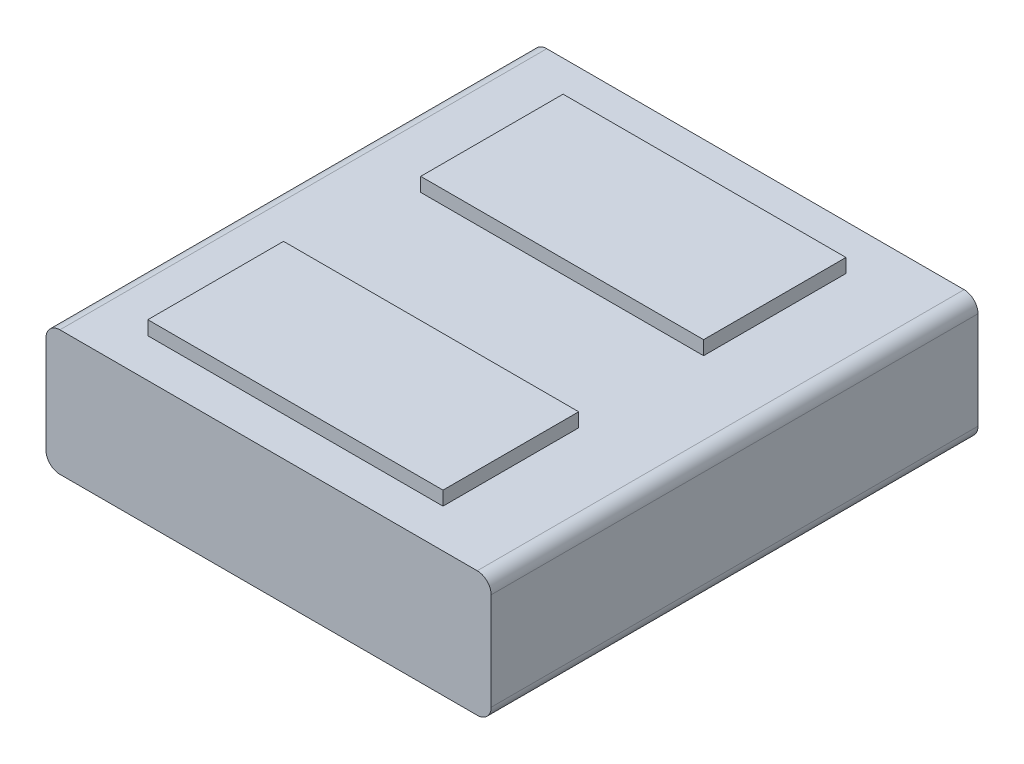
ISO-10303-21;
HEADER;
FILE_DESCRIPTION(('STEP AP214'),'2;1');
FILE_NAME('part.step','',(''),(''),'','','');
FILE_SCHEMA(('AUTOMOTIVE_DESIGN { 1 0 10303 214 1 1 1 1 }'));
ENDSEC;
DATA;
#1=APPLICATION_CONTEXT('core data for automotive mechanical design processes');
#2=APPLICATION_PROTOCOL_DEFINITION('international standard','automotive_design',2000,#1);
#3=PRODUCT_CONTEXT('',#1,'mechanical');
#4=PRODUCT('Part','Part','',(#3));
#5=PRODUCT_RELATED_PRODUCT_CATEGORY('part','',(#4));
#6=PRODUCT_DEFINITION_FORMATION('','',#4);
#7=PRODUCT_DEFINITION_CONTEXT('part definition',#1,'design');
#8=PRODUCT_DEFINITION('design','',#6,#7);
#9=PRODUCT_DEFINITION_SHAPE('','',#8);
#10=(LENGTH_UNIT() NAMED_UNIT(*) SI_UNIT(.MILLI.,.METRE.));
#11=(NAMED_UNIT(*) PLANE_ANGLE_UNIT() SI_UNIT($,.RADIAN.));
#12=(NAMED_UNIT(*) SI_UNIT($,.STERADIAN.) SOLID_ANGLE_UNIT());
#13=UNCERTAINTY_MEASURE_WITH_UNIT(LENGTH_MEASURE(1.E-05),#10,'distance_accuracy_value','');
#14=(GEOMETRIC_REPRESENTATION_CONTEXT(3) GLOBAL_UNCERTAINTY_ASSIGNED_CONTEXT((#13)) GLOBAL_UNIT_ASSIGNED_CONTEXT((#10,
#11,#12)) REPRESENTATION_CONTEXT('',''));
#15=CARTESIAN_POINT('',(0.,0.,0.));
#16=DIRECTION('',(0.,0.,1.));
#17=DIRECTION('',(1.,0.,0.));
#18=AXIS2_PLACEMENT_3D('',#15,#16,#17);
#19=CARTESIAN_POINT('',(10.8302481074247,20.,26.955321263074));
#20=DIRECTION('',(1.,0.,0.));
#21=DIRECTION('',(0.,0.,-1.));
#22=AXIS2_PLACEMENT_3D('',#19,#20,#21);
#23=PLANE('',#22);
#24=DIRECTION('',(0.,0.,1.));
#25=VECTOR('',#24,1.);
#26=CARTESIAN_POINT('',(10.8302481074247,18.,26.955321263074));
#27=LINE('',#26,#25);
#28=CARTESIAN_POINT('',(10.8302481074247,18.,6.48513491665881));
#29=VERTEX_POINT('',#28);
#30=CARTESIAN_POINT('',(10.8302481074247,18.,26.955321263074));
#31=VERTEX_POINT('',#30);
#32=EDGE_CURVE('E110',#29,#31,#27,.T.);
#33=ORIENTED_EDGE('',*,*,#32,.T.);
#34=DIRECTION('',(0.,-1.,0.));
#35=VECTOR('',#34,1.);
#36=CARTESIAN_POINT('',(10.8302481074247,20.,26.955321263074));
#37=LINE('',#36,#35);
#38=CARTESIAN_POINT('',(10.8302481074247,20.,26.955321263074));
#39=VERTEX_POINT('',#38);
#40=EDGE_CURVE('E12',#39,#31,#37,.T.);
#41=ORIENTED_EDGE('',*,*,#40,.F.);
#42=DIRECTION('',(0.,0.,1.));
#43=VECTOR('',#42,1.);
#44=CARTESIAN_POINT('',(10.8302481074247,20.,26.955321263074));
#45=LINE('',#44,#43);
#46=CARTESIAN_POINT('',(10.8302481074247,20.,6.48513491665881));
#47=VERTEX_POINT('',#46);
#48=EDGE_CURVE('E98',#47,#39,#45,.T.);
#49=ORIENTED_EDGE('',*,*,#48,.F.);
#50=DIRECTION('',(0.,-1.,0.));
#51=VECTOR('',#50,1.);
#52=CARTESIAN_POINT('',(10.8302481074247,20.,6.48513491665881));
#53=LINE('',#52,#51);
#54=EDGE_CURVE('E106',#47,#29,#53,.T.);
#55=ORIENTED_EDGE('',*,*,#54,.T.);
#56=EDGE_LOOP('',(#33,#41,#49,#55));
#57=FACE_BOUND('',#56,.T.);
#58=ADVANCED_FACE('F47',(#57),#23,.F.);
#59=CARTESIAN_POINT('',(10.8302481074247,20.,26.955321263074));
#60=DIRECTION('',(0.,0.,-1.));
#61=DIRECTION('',(-1.,0.,0.));
#62=AXIS2_PLACEMENT_3D('',#59,#60,#61);
#63=PLANE('',#62);
#64=DIRECTION('',(1.,0.,0.));
#65=VECTOR('',#64,1.);
#66=CARTESIAN_POINT('',(10.8302481074247,18.,26.955321263074));
#67=LINE('',#66,#65);
#68=CARTESIAN_POINT('',(51.4996877579961,18.,26.955321263074));
#69=VERTEX_POINT('',#68);
#70=EDGE_CURVE('E102',#31,#69,#67,.T.);
#71=ORIENTED_EDGE('',*,*,#70,.T.);
#72=DIRECTION('',(0.,-1.,0.));
#73=VECTOR('',#72,1.);
#74=CARTESIAN_POINT('',(51.4996877579961,20.,26.955321263074));
#75=LINE('',#74,#73);
#76=CARTESIAN_POINT('',(51.4996877579961,20.,26.955321263074));
#77=VERTEX_POINT('',#76);
#78=EDGE_CURVE('E55',#77,#69,#75,.T.);
#79=ORIENTED_EDGE('',*,*,#78,.F.);
#80=DIRECTION('',(1.,0.,0.));
#81=VECTOR('',#80,1.);
#82=CARTESIAN_POINT('',(10.8302481074247,20.,26.955321263074));
#83=LINE('',#82,#81);
#84=EDGE_CURVE('E93',#39,#77,#83,.T.);
#85=ORIENTED_EDGE('',*,*,#84,.F.);
#86=ORIENTED_EDGE('',*,*,#40,.T.);
#87=EDGE_LOOP('',(#71,#79,#85,#86));
#88=FACE_BOUND('',#87,.T.);
#89=ADVANCED_FACE('F101',(#88),#63,.F.);
#90=CARTESIAN_POINT('',(51.4996877579961,20.,26.955321263074));
#91=DIRECTION('',(-1.,0.,0.));
#92=DIRECTION('',(0.,0.,1.));
#93=AXIS2_PLACEMENT_3D('',#90,#91,#92);
#94=PLANE('',#93);
#95=DIRECTION('',(0.,0.,-1.));
#96=VECTOR('',#95,1.);
#97=CARTESIAN_POINT('',(51.4996877579961,18.,26.955321263074));
#98=LINE('',#97,#96);
#99=CARTESIAN_POINT('',(51.4996877579961,18.,6.48513491665881));
#100=VERTEX_POINT('',#99);
#101=EDGE_CURVE('E80',#69,#100,#98,.T.);
#102=ORIENTED_EDGE('',*,*,#101,.T.);
#103=DIRECTION('',(0.,-1.,0.));
#104=VECTOR('',#103,1.);
#105=CARTESIAN_POINT('',(51.4996877579961,20.,6.48513491665881));
#106=LINE('',#105,#104);
#107=CARTESIAN_POINT('',(51.4996877579961,20.,6.48513491665881));
#108=VERTEX_POINT('',#107);
#109=EDGE_CURVE('E103',#108,#100,#106,.T.);
#110=ORIENTED_EDGE('',*,*,#109,.F.);
#111=DIRECTION('',(0.,0.,-1.));
#112=VECTOR('',#111,1.);
#113=CARTESIAN_POINT('',(51.4996877579961,20.,26.955321263074));
#114=LINE('',#113,#112);
#115=EDGE_CURVE('E96',#77,#108,#114,.T.);
#116=ORIENTED_EDGE('',*,*,#115,.F.);
#117=ORIENTED_EDGE('',*,*,#78,.T.);
#118=EDGE_LOOP('',(#102,#110,#116,#117));
#119=FACE_BOUND('',#118,.T.);
#120=ADVANCED_FACE('F104',(#119),#94,.F.);
#121=CARTESIAN_POINT('',(10.8302481074247,20.,6.48513491665881));
#122=DIRECTION('',(0.,0.,1.));
#123=DIRECTION('',(1.,0.,0.));
#124=AXIS2_PLACEMENT_3D('',#121,#122,#123);
#125=PLANE('',#124);
#126=DIRECTION('',(-1.,0.,0.));
#127=VECTOR('',#126,1.);
#128=CARTESIAN_POINT('',(10.8302481074247,18.,6.48513491665881));
#129=LINE('',#128,#127);
#130=EDGE_CURVE('E86',#100,#29,#129,.T.);
#131=ORIENTED_EDGE('',*,*,#130,.T.);
#132=ORIENTED_EDGE('',*,*,#54,.F.);
#133=DIRECTION('',(-1.,0.,0.));
#134=VECTOR('',#133,1.);
#135=CARTESIAN_POINT('',(10.8302481074247,20.,6.48513491665881));
#136=LINE('',#135,#134);
#137=EDGE_CURVE('E63',#108,#47,#136,.T.);
#138=ORIENTED_EDGE('',*,*,#137,.F.);
#139=ORIENTED_EDGE('',*,*,#109,.T.);
#140=EDGE_LOOP('',(#131,#132,#138,#139));
#141=FACE_BOUND('',#140,.T.);
#142=ADVANCED_FACE('F117',(#141),#125,.F.);
#143=CARTESIAN_POINT('',(0.,20.,0.));
#144=DIRECTION('',(0.,-1.,0.));
#145=DIRECTION('',(0.,0.,-1.));
#146=AXIS2_PLACEMENT_3D('',#143,#144,#145);
#147=PLANE('',#146);
#148=ORIENTED_EDGE('',*,*,#48,.T.);
#149=ORIENTED_EDGE('',*,*,#84,.T.);
#150=ORIENTED_EDGE('',*,*,#115,.T.);
#151=ORIENTED_EDGE('',*,*,#137,.T.);
#152=EDGE_LOOP('',(#148,#149,#150,#151));
#153=FACE_BOUND('',#152,.T.);
#154=ADVANCED_FACE('F94',(#153),#147,.F.);
#155=CARTESIAN_POINT('',(0.,18.,0.));
#156=DIRECTION('',(0.,-1.,0.));
#157=DIRECTION('',(0.,0.,-1.));
#158=AXIS2_PLACEMENT_3D('',#155,#156,#157);
#159=PLANE('',#158);
#160=ORIENTED_EDGE('',*,*,#32,.F.);
#161=ORIENTED_EDGE('',*,*,#130,.F.);
#162=ORIENTED_EDGE('',*,*,#101,.F.);
#163=ORIENTED_EDGE('',*,*,#70,.F.);
#164=EDGE_LOOP('',(#160,#161,#162,#163));
#165=FACE_BOUND('',#164,.T.);
#166=ADVANCED_FACE('F120',(#165),#159,.T.);
#167=CLOSED_SHELL('',(#58,#89,#120,#142,#154,#166));
#168=MANIFOLD_SOLID_BREP('B2',#167);
#169=CARTESIAN_POINT('',(9.06151574918113,20.,64.421161213204));
#170=DIRECTION('',(1.,0.,0.));
#171=DIRECTION('',(0.,0.,-1.));
#172=AXIS2_PLACEMENT_3D('',#169,#170,#171);
#173=PLANE('',#172);
#174=DIRECTION('',(0.,0.,1.));
#175=VECTOR('',#174,1.);
#176=CARTESIAN_POINT('',(9.06151574918113,18.,64.421161213204));
#177=LINE('',#176,#175);
#178=CARTESIAN_POINT('',(9.06151574918113,18.,44.9112612927252));
#179=VERTEX_POINT('',#178);
#180=CARTESIAN_POINT('',(9.06151574918113,18.,64.421161213204));
#181=VERTEX_POINT('',#180);
#182=EDGE_CURVE('E242',#179,#181,#177,.T.);
#183=ORIENTED_EDGE('',*,*,#182,.T.);
#184=DIRECTION('',(0.,-1.,0.));
#185=VECTOR('',#184,1.);
#186=CARTESIAN_POINT('',(9.06151574918113,20.,64.421161213204));
#187=LINE('',#186,#185);
#188=CARTESIAN_POINT('',(9.06151574918113,20.,64.421161213204));
#189=VERTEX_POINT('',#188);
#190=EDGE_CURVE('E45',#189,#181,#187,.T.);
#191=ORIENTED_EDGE('',*,*,#190,.F.);
#192=DIRECTION('',(0.,0.,1.));
#193=VECTOR('',#192,1.);
#194=CARTESIAN_POINT('',(9.06151574918113,20.,64.421161213204));
#195=LINE('',#194,#193);
#196=CARTESIAN_POINT('',(9.06151574918113,20.,44.9112612927252));
#197=VERTEX_POINT('',#196);
#198=EDGE_CURVE('E230',#197,#189,#195,.T.);
#199=ORIENTED_EDGE('',*,*,#198,.F.);
#200=DIRECTION('',(0.,-1.,0.));
#201=VECTOR('',#200,1.);
#202=CARTESIAN_POINT('',(9.06151574918113,20.,44.9112612927252));
#203=LINE('',#202,#201);
#204=EDGE_CURVE('E238',#197,#179,#203,.T.);
#205=ORIENTED_EDGE('',*,*,#204,.T.);
#206=EDGE_LOOP('',(#183,#191,#199,#205));
#207=FACE_BOUND('',#206,.T.);
#208=ADVANCED_FACE('F179',(#207),#173,.F.);
#209=CARTESIAN_POINT('',(9.06151574918113,20.,64.421161213204));
#210=DIRECTION('',(0.,0.,-1.));
#211=DIRECTION('',(-1.,0.,0.));
#212=AXIS2_PLACEMENT_3D('',#209,#210,#211);
#213=PLANE('',#212);
#214=DIRECTION('',(1.,0.,0.));
#215=VECTOR('',#214,1.);
#216=CARTESIAN_POINT('',(9.06151574918113,18.,64.421161213204));
#217=LINE('',#216,#215);
#218=CARTESIAN_POINT('',(51.4996877579961,18.,64.421161213204));
#219=VERTEX_POINT('',#218);
#220=EDGE_CURVE('E234',#181,#219,#217,.T.);
#221=ORIENTED_EDGE('',*,*,#220,.T.);
#222=DIRECTION('',(0.,-1.,0.));
#223=VECTOR('',#222,1.);
#224=CARTESIAN_POINT('',(51.4996877579961,20.,64.421161213204));
#225=LINE('',#224,#223);
#226=CARTESIAN_POINT('',(51.4996877579961,20.,64.421161213204));
#227=VERTEX_POINT('',#226);
#228=EDGE_CURVE('E187',#227,#219,#225,.T.);
#229=ORIENTED_EDGE('',*,*,#228,.F.);
#230=DIRECTION('',(1.,0.,0.));
#231=VECTOR('',#230,1.);
#232=CARTESIAN_POINT('',(9.06151574918113,20.,64.421161213204));
#233=LINE('',#232,#231);
#234=EDGE_CURVE('E225',#189,#227,#233,.T.);
#235=ORIENTED_EDGE('',*,*,#234,.F.);
#236=ORIENTED_EDGE('',*,*,#190,.T.);
#237=EDGE_LOOP('',(#221,#229,#235,#236));
#238=FACE_BOUND('',#237,.T.);
#239=ADVANCED_FACE('F233',(#238),#213,.F.);
#240=CARTESIAN_POINT('',(51.4996877579961,20.,64.421161213204));
#241=DIRECTION('',(-1.,0.,0.));
#242=DIRECTION('',(0.,0.,1.));
#243=AXIS2_PLACEMENT_3D('',#240,#241,#242);
#244=PLANE('',#243);
#245=DIRECTION('',(0.,0.,-1.));
#246=VECTOR('',#245,1.);
#247=CARTESIAN_POINT('',(51.4996877579961,18.,64.421161213204));
#248=LINE('',#247,#246);
#249=CARTESIAN_POINT('',(51.4996877579961,18.,44.9112612927252));
#250=VERTEX_POINT('',#249);
#251=EDGE_CURVE('E212',#219,#250,#248,.T.);
#252=ORIENTED_EDGE('',*,*,#251,.T.);
#253=DIRECTION('',(0.,-1.,0.));
#254=VECTOR('',#253,1.);
#255=CARTESIAN_POINT('',(51.4996877579961,20.,44.9112612927252));
#256=LINE('',#255,#254);
#257=CARTESIAN_POINT('',(51.4996877579961,20.,44.9112612927252));
#258=VERTEX_POINT('',#257);
#259=EDGE_CURVE('E235',#258,#250,#256,.T.);
#260=ORIENTED_EDGE('',*,*,#259,.F.);
#261=DIRECTION('',(0.,0.,-1.));
#262=VECTOR('',#261,1.);
#263=CARTESIAN_POINT('',(51.4996877579961,20.,64.421161213204));
#264=LINE('',#263,#262);
#265=EDGE_CURVE('E228',#227,#258,#264,.T.);
#266=ORIENTED_EDGE('',*,*,#265,.F.);
#267=ORIENTED_EDGE('',*,*,#228,.T.);
#268=EDGE_LOOP('',(#252,#260,#266,#267));
#269=FACE_BOUND('',#268,.T.);
#270=ADVANCED_FACE('F236',(#269),#244,.F.);
#271=CARTESIAN_POINT('',(9.06151574918113,20.,44.9112612927252));
#272=DIRECTION('',(0.,0.,1.));
#273=DIRECTION('',(1.,0.,0.));
#274=AXIS2_PLACEMENT_3D('',#271,#272,#273);
#275=PLANE('',#274);
#276=DIRECTION('',(-1.,0.,0.));
#277=VECTOR('',#276,1.);
#278=CARTESIAN_POINT('',(9.06151574918113,18.,44.9112612927252));
#279=LINE('',#278,#277);
#280=EDGE_CURVE('E218',#250,#179,#279,.T.);
#281=ORIENTED_EDGE('',*,*,#280,.T.);
#282=ORIENTED_EDGE('',*,*,#204,.F.);
#283=DIRECTION('',(-1.,0.,0.));
#284=VECTOR('',#283,1.);
#285=CARTESIAN_POINT('',(9.06151574918113,20.,44.9112612927252));
#286=LINE('',#285,#284);
#287=EDGE_CURVE('E195',#258,#197,#286,.T.);
#288=ORIENTED_EDGE('',*,*,#287,.F.);
#289=ORIENTED_EDGE('',*,*,#259,.T.);
#290=EDGE_LOOP('',(#281,#282,#288,#289));
#291=FACE_BOUND('',#290,.T.);
#292=ADVANCED_FACE('F249',(#291),#275,.F.);
#293=CARTESIAN_POINT('',(0.,20.,0.));
#294=DIRECTION('',(0.,-1.,0.));
#295=DIRECTION('',(0.,0.,-1.));
#296=AXIS2_PLACEMENT_3D('',#293,#294,#295);
#297=PLANE('',#296);
#298=ORIENTED_EDGE('',*,*,#198,.T.);
#299=ORIENTED_EDGE('',*,*,#234,.T.);
#300=ORIENTED_EDGE('',*,*,#265,.T.);
#301=ORIENTED_EDGE('',*,*,#287,.T.);
#302=EDGE_LOOP('',(#298,#299,#300,#301));
#303=FACE_BOUND('',#302,.T.);
#304=ADVANCED_FACE('F226',(#303),#297,.F.);
#305=CARTESIAN_POINT('',(0.,18.,0.));
#306=DIRECTION('',(0.,-1.,0.));
#307=DIRECTION('',(0.,0.,-1.));
#308=AXIS2_PLACEMENT_3D('',#305,#306,#307);
#309=PLANE('',#308);
#310=ORIENTED_EDGE('',*,*,#182,.F.);
#311=ORIENTED_EDGE('',*,*,#280,.F.);
#312=ORIENTED_EDGE('',*,*,#251,.F.);
#313=ORIENTED_EDGE('',*,*,#220,.F.);
#314=EDGE_LOOP('',(#310,#311,#312,#313));
#315=FACE_BOUND('',#314,.T.);
#316=ADVANCED_FACE('F252',(#315),#309,.T.);
#317=CLOSED_SHELL('',(#208,#239,#270,#292,#304,#316));
#318=MANIFOLD_SOLID_BREP('B6',#317);
#319=CARTESIAN_POINT('',(0.,0.,70.));
#320=DIRECTION('',(1.,0.,0.));
#321=DIRECTION('',(0.,0.,-1.));
#322=AXIS2_PLACEMENT_3D('',#319,#320,#321);
#323=PLANE('',#322);
#324=DIRECTION('',(0.,-1.,0.));
#325=VECTOR('',#324,1.);
#326=CARTESIAN_POINT('',(0.,0.,0.));
#327=LINE('',#326,#325);
#328=CARTESIAN_POINT('',(0.,16.,0.));
#329=VERTEX_POINT('',#328);
#330=CARTESIAN_POINT('',(0.,2.,0.));
#331=VERTEX_POINT('',#330);
#332=EDGE_CURVE('E398',#329,#331,#327,.T.);
#333=ORIENTED_EDGE('',*,*,#332,.T.);
#334=DIRECTION('',(0.,0.,-1.));
#335=VECTOR('',#334,1.);
#336=CARTESIAN_POINT('',(0.,2.,70.));
#337=LINE('',#336,#335);
#338=CARTESIAN_POINT('',(0.,2.,70.));
#339=VERTEX_POINT('',#338);
#340=EDGE_CURVE('E421',#331,#339,#337,.F.);
#341=ORIENTED_EDGE('',*,*,#340,.T.);
#342=DIRECTION('',(0.,-1.,0.));
#343=VECTOR('',#342,1.);
#344=CARTESIAN_POINT('',(0.,0.,70.));
#345=LINE('',#344,#343);
#346=CARTESIAN_POINT('',(0.,16.,70.));
#347=VERTEX_POINT('',#346);
#348=EDGE_CURVE('E396',#347,#339,#345,.T.);
#349=ORIENTED_EDGE('',*,*,#348,.F.);
#350=DIRECTION('',(0.,0.,-1.));
#351=VECTOR('',#350,1.);
#352=CARTESIAN_POINT('',(0.,16.,70.));
#353=LINE('',#352,#351);
#354=EDGE_CURVE('E418',#347,#329,#353,.T.);
#355=ORIENTED_EDGE('',*,*,#354,.T.);
#356=EDGE_LOOP('',(#333,#341,#349,#355));
#357=FACE_BOUND('',#356,.T.);
#358=ADVANCED_FACE('F303',(#357),#323,.F.);
#359=CARTESIAN_POINT('',(0.,0.,70.));
#360=DIRECTION('',(0.,1.,0.));
#361=DIRECTION('',(0.,0.,1.));
#362=AXIS2_PLACEMENT_3D('',#359,#360,#361);
#363=PLANE('',#362);
#364=DIRECTION('',(1.,0.,0.));
#365=VECTOR('',#364,1.);
#366=CARTESIAN_POINT('',(0.,0.,0.));
#367=LINE('',#366,#365);
#368=CARTESIAN_POINT('',(2.,0.,0.));
#369=VERTEX_POINT('',#368);
#370=CARTESIAN_POINT('',(62.,0.,0.));
#371=VERTEX_POINT('',#370);
#372=EDGE_CURVE('E394',#369,#371,#367,.T.);
#373=ORIENTED_EDGE('',*,*,#372,.T.);
#374=DIRECTION('',(0.,0.,-1.));
#375=VECTOR('',#374,1.);
#376=CARTESIAN_POINT('',(62.,0.,70.));
#377=LINE('',#376,#375);
#378=CARTESIAN_POINT('',(62.,0.,70.));
#379=VERTEX_POINT('',#378);
#380=EDGE_CURVE('E373',#371,#379,#377,.F.);
#381=ORIENTED_EDGE('',*,*,#380,.T.);
#382=DIRECTION('',(1.,0.,0.));
#383=VECTOR('',#382,1.);
#384=CARTESIAN_POINT('',(0.,0.,70.));
#385=LINE('',#384,#383);
#386=CARTESIAN_POINT('',(2.,0.,70.));
#387=VERTEX_POINT('',#386);
#388=EDGE_CURVE('E437',#387,#379,#385,.T.);
#389=ORIENTED_EDGE('',*,*,#388,.F.);
#390=DIRECTION('',(0.,0.,-1.));
#391=VECTOR('',#390,1.);
#392=CARTESIAN_POINT('',(2.,0.,70.));
#393=LINE('',#392,#391);
#394=EDGE_CURVE('E378',#387,#369,#393,.T.);
#395=ORIENTED_EDGE('',*,*,#394,.T.);
#396=EDGE_LOOP('',(#373,#381,#389,#395));
#397=FACE_BOUND('',#396,.T.);
#398=ADVANCED_FACE('F454',(#397),#363,.F.);
#399=CARTESIAN_POINT('',(64.,0.,70.));
#400=DIRECTION('',(-1.,0.,0.));
#401=DIRECTION('',(0.,0.,1.));
#402=AXIS2_PLACEMENT_3D('',#399,#400,#401);
#403=PLANE('',#402);
#404=DIRECTION('',(0.,1.,0.));
#405=VECTOR('',#404,1.);
#406=CARTESIAN_POINT('',(64.,0.,70.));
#407=LINE('',#406,#405);
#408=CARTESIAN_POINT('',(64.,2.,70.));
#409=VERTEX_POINT('',#408);
#410=CARTESIAN_POINT('',(64.,16.,70.));
#411=VERTEX_POINT('',#410);
#412=EDGE_CURVE('E387',#409,#411,#407,.T.);
#413=ORIENTED_EDGE('',*,*,#412,.F.);
#414=DIRECTION('',(0.,0.,-1.));
#415=VECTOR('',#414,1.);
#416=CARTESIAN_POINT('',(64.,2.,70.));
#417=LINE('',#416,#415);
#418=CARTESIAN_POINT('',(64.,2.,0.));
#419=VERTEX_POINT('',#418);
#420=EDGE_CURVE('E372',#409,#419,#417,.T.);
#421=ORIENTED_EDGE('',*,*,#420,.T.);
#422=DIRECTION('',(0.,1.,0.));
#423=VECTOR('',#422,1.);
#424=CARTESIAN_POINT('',(64.,0.,0.));
#425=LINE('',#424,#423);
#426=CARTESIAN_POINT('',(64.,16.,0.));
#427=VERTEX_POINT('',#426);
#428=EDGE_CURVE('E385',#419,#427,#425,.T.);
#429=ORIENTED_EDGE('',*,*,#428,.T.);
#430=DIRECTION('',(0.,0.,-1.));
#431=VECTOR('',#430,1.);
#432=CARTESIAN_POINT('',(64.,16.,70.));
#433=LINE('',#432,#431);
#434=EDGE_CURVE('E389',#427,#411,#433,.F.);
#435=ORIENTED_EDGE('',*,*,#434,.T.);
#436=EDGE_LOOP('',(#413,#421,#429,#435));
#437=FACE_BOUND('',#436,.T.);
#438=ADVANCED_FACE('F384',(#437),#403,.F.);
#439=CARTESIAN_POINT('',(0.,18.,70.));
#440=DIRECTION('',(0.,-1.,0.));
#441=DIRECTION('',(0.,0.,-1.));
#442=AXIS2_PLACEMENT_3D('',#439,#440,#441);
#443=PLANE('',#442);
#444=DIRECTION('',(-1.,0.,0.));
#445=VECTOR('',#444,1.);
#446=CARTESIAN_POINT('',(0.,18.,0.));
#447=LINE('',#446,#445);
#448=CARTESIAN_POINT('',(62.,18.,0.));
#449=VERTEX_POINT('',#448);
#450=CARTESIAN_POINT('',(2.,18.,0.));
#451=VERTEX_POINT('',#450);
#452=EDGE_CURVE('E393',#449,#451,#447,.T.);
#453=ORIENTED_EDGE('',*,*,#452,.T.);
#454=DIRECTION('',(0.,0.,-1.));
#455=VECTOR('',#454,1.);
#456=CARTESIAN_POINT('',(2.,18.,70.));
#457=LINE('',#456,#455);
#458=CARTESIAN_POINT('',(2.,18.,70.));
#459=VERTEX_POINT('',#458);
#460=EDGE_CURVE('E177',#451,#459,#457,.F.);
#461=ORIENTED_EDGE('',*,*,#460,.T.);
#462=DIRECTION('',(-1.,0.,0.));
#463=VECTOR('',#462,1.);
#464=CARTESIAN_POINT('',(0.,18.,70.));
#465=LINE('',#464,#463);
#466=CARTESIAN_POINT('',(62.,18.,70.));
#467=VERTEX_POINT('',#466);
#468=EDGE_CURVE('E402',#467,#459,#465,.T.);
#469=ORIENTED_EDGE('',*,*,#468,.F.);
#470=DIRECTION('',(0.,0.,-1.));
#471=VECTOR('',#470,1.);
#472=CARTESIAN_POINT('',(62.,18.,70.));
#473=LINE('',#472,#471);
#474=EDGE_CURVE('E311',#467,#449,#473,.T.);
#475=ORIENTED_EDGE('',*,*,#474,.T.);
#476=EDGE_LOOP('',(#453,#461,#469,#475));
#477=FACE_BOUND('',#476,.T.);
#478=ADVANCED_FACE('F424',(#477),#443,.F.);
#479=CARTESIAN_POINT('',(0.,0.,70.));
#480=DIRECTION('',(0.,0.,-1.));
#481=DIRECTION('',(-1.,0.,0.));
#482=AXIS2_PLACEMENT_3D('',#479,#480,#481);
#483=PLANE('',#482);
#484=ORIENTED_EDGE('',*,*,#388,.T.);
#485=CARTESIAN_POINT('',(62.,2.,70.));
#486=DIRECTION('',(0.,0.,-1.));
#487=DIRECTION('',(-1.,0.,0.));
#488=AXIS2_PLACEMENT_3D('',#485,#486,#487);
#489=CIRCLE('',#488,2.);
#490=EDGE_CURVE('E416',#379,#409,#489,.F.);
#491=ORIENTED_EDGE('',*,*,#490,.T.);
#492=ORIENTED_EDGE('',*,*,#412,.T.);
#493=CARTESIAN_POINT('',(62.,16.,70.));
#494=DIRECTION('',(0.,0.,-1.));
#495=DIRECTION('',(-1.,0.,0.));
#496=AXIS2_PLACEMENT_3D('',#493,#494,#495);
#497=CIRCLE('',#496,2.);
#498=EDGE_CURVE('E323',#411,#467,#497,.F.);
#499=ORIENTED_EDGE('',*,*,#498,.T.);
#500=ORIENTED_EDGE('',*,*,#468,.T.);
#501=CARTESIAN_POINT('',(2.,16.,70.));
#502=DIRECTION('',(0.,0.,-1.));
#503=DIRECTION('',(-1.,0.,0.));
#504=AXIS2_PLACEMENT_3D('',#501,#502,#503);
#505=CIRCLE('',#504,2.);
#506=EDGE_CURVE('E412',#459,#347,#505,.F.);
#507=ORIENTED_EDGE('',*,*,#506,.T.);
#508=ORIENTED_EDGE('',*,*,#348,.T.);
#509=CARTESIAN_POINT('',(2.,2.,70.));
#510=DIRECTION('',(0.,0.,-1.));
#511=DIRECTION('',(-1.,0.,0.));
#512=AXIS2_PLACEMENT_3D('',#509,#510,#511);
#513=CIRCLE('',#512,2.);
#514=EDGE_CURVE('E414',#339,#387,#513,.F.);
#515=ORIENTED_EDGE('',*,*,#514,.T.);
#516=EDGE_LOOP('',(#484,#491,#492,#499,#500,#507,#508,#515));
#517=FACE_BOUND('',#516,.T.);
#518=ADVANCED_FACE('F443',(#517),#483,.F.);
#519=CARTESIAN_POINT('',(0.,0.,0.));
#520=DIRECTION('',(0.,0.,-1.));
#521=DIRECTION('',(-1.,0.,0.));
#522=AXIS2_PLACEMENT_3D('',#519,#520,#521);
#523=PLANE('',#522);
#524=ORIENTED_EDGE('',*,*,#428,.F.);
#525=CARTESIAN_POINT('',(62.,2.,0.));
#526=DIRECTION('',(0.,0.,-1.));
#527=DIRECTION('',(-1.,0.,0.));
#528=AXIS2_PLACEMENT_3D('',#525,#526,#527);
#529=CIRCLE('',#528,2.);
#530=EDGE_CURVE('E368',#419,#371,#529,.T.);
#531=ORIENTED_EDGE('',*,*,#530,.T.);
#532=ORIENTED_EDGE('',*,*,#372,.F.);
#533=CARTESIAN_POINT('',(2.,2.,0.));
#534=DIRECTION('',(0.,0.,-1.));
#535=DIRECTION('',(-1.,0.,0.));
#536=AXIS2_PLACEMENT_3D('',#533,#534,#535);
#537=CIRCLE('',#536,2.);
#538=EDGE_CURVE('E379',#369,#331,#537,.T.);
#539=ORIENTED_EDGE('',*,*,#538,.T.);
#540=ORIENTED_EDGE('',*,*,#332,.F.);
#541=CARTESIAN_POINT('',(2.,16.,0.));
#542=DIRECTION('',(0.,0.,-1.));
#543=DIRECTION('',(-1.,0.,0.));
#544=AXIS2_PLACEMENT_3D('',#541,#542,#543);
#545=CIRCLE('',#544,2.);
#546=EDGE_CURVE('E405',#329,#451,#545,.T.);
#547=ORIENTED_EDGE('',*,*,#546,.T.);
#548=ORIENTED_EDGE('',*,*,#452,.F.);
#549=CARTESIAN_POINT('',(62.,16.,0.));
#550=DIRECTION('',(0.,0.,-1.));
#551=DIRECTION('',(-1.,0.,0.));
#552=AXIS2_PLACEMENT_3D('',#549,#550,#551);
#553=CIRCLE('',#552,2.);
#554=EDGE_CURVE('E388',#449,#427,#553,.T.);
#555=ORIENTED_EDGE('',*,*,#554,.T.);
#556=EDGE_LOOP('',(#524,#531,#532,#539,#540,#547,#548,#555));
#557=FACE_BOUND('',#556,.T.);
#558=ADVANCED_FACE('F391',(#557),#523,.T.);
#559=CARTESIAN_POINT('',(62.,2.,70.));
#560=DIRECTION('',(0.,0.,-1.));
#561=DIRECTION('',(-1.,0.,0.));
#562=AXIS2_PLACEMENT_3D('',#559,#560,#561);
#563=CYLINDRICAL_SURFACE('',#562,2.);
#564=ORIENTED_EDGE('',*,*,#490,.F.);
#565=ORIENTED_EDGE('',*,*,#380,.F.);
#566=ORIENTED_EDGE('',*,*,#530,.F.);
#567=ORIENTED_EDGE('',*,*,#420,.F.);
#568=EDGE_LOOP('',(#564,#565,#566,#567));
#569=FACE_BOUND('',#568,.T.);
#570=ADVANCED_FACE('F371',(#569),#563,.T.);
#571=CARTESIAN_POINT('',(2.,2.,70.));
#572=DIRECTION('',(0.,0.,-1.));
#573=DIRECTION('',(-1.,0.,0.));
#574=AXIS2_PLACEMENT_3D('',#571,#572,#573);
#575=CYLINDRICAL_SURFACE('',#574,2.);
#576=ORIENTED_EDGE('',*,*,#514,.F.);
#577=ORIENTED_EDGE('',*,*,#340,.F.);
#578=ORIENTED_EDGE('',*,*,#538,.F.);
#579=ORIENTED_EDGE('',*,*,#394,.F.);
#580=EDGE_LOOP('',(#576,#577,#578,#579));
#581=FACE_BOUND('',#580,.T.);
#582=ADVANCED_FACE('F465',(#581),#575,.T.);
#583=CARTESIAN_POINT('',(2.,16.,70.));
#584=DIRECTION('',(0.,0.,-1.));
#585=DIRECTION('',(-1.,0.,0.));
#586=AXIS2_PLACEMENT_3D('',#583,#584,#585);
#587=CYLINDRICAL_SURFACE('',#586,2.);
#588=ORIENTED_EDGE('',*,*,#506,.F.);
#589=ORIENTED_EDGE('',*,*,#460,.F.);
#590=ORIENTED_EDGE('',*,*,#546,.F.);
#591=ORIENTED_EDGE('',*,*,#354,.F.);
#592=EDGE_LOOP('',(#588,#589,#590,#591));
#593=FACE_BOUND('',#592,.T.);
#594=ADVANCED_FACE('F431',(#593),#587,.T.);
#595=CARTESIAN_POINT('',(62.,16.,70.));
#596=DIRECTION('',(0.,0.,-1.));
#597=DIRECTION('',(-1.,0.,0.));
#598=AXIS2_PLACEMENT_3D('',#595,#596,#597);
#599=CYLINDRICAL_SURFACE('',#598,2.);
#600=ORIENTED_EDGE('',*,*,#498,.F.);
#601=ORIENTED_EDGE('',*,*,#434,.F.);
#602=ORIENTED_EDGE('',*,*,#554,.F.);
#603=ORIENTED_EDGE('',*,*,#474,.F.);
#604=EDGE_LOOP('',(#600,#601,#602,#603));
#605=FACE_BOUND('',#604,.T.);
#606=ADVANCED_FACE('F305',(#605),#599,.T.);
#607=CLOSED_SHELL('',(#358,#398,#438,#478,#518,#558,#570,#582,#594,#606));
#608=MANIFOLD_SOLID_BREP('B39',#607);
#609=ADVANCED_BREP_SHAPE_REPRESENTATION('',(#18,#168,#318,#608),#14);
#610=SHAPE_DEFINITION_REPRESENTATION(#9,#609);
ENDSEC;
END-ISO-10303-21;
